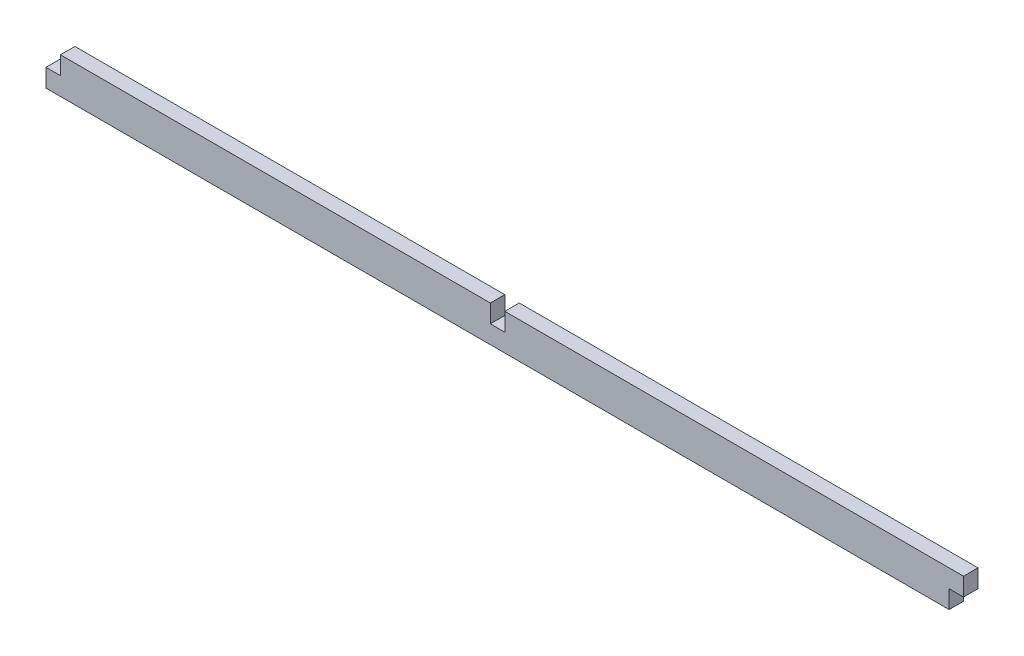
ISO-10303-21;
HEADER;
FILE_DESCRIPTION(('STEP AP214'),'2;1');
FILE_NAME('part.step','',(''),(''),'','','');
FILE_SCHEMA(('AUTOMOTIVE_DESIGN { 1 0 10303 214 1 1 1 1 }'));
ENDSEC;
DATA;
#1=APPLICATION_CONTEXT('core data for automotive mechanical design processes');
#2=APPLICATION_PROTOCOL_DEFINITION('international standard','automotive_design',2000,#1);
#3=PRODUCT_CONTEXT('',#1,'mechanical');
#4=PRODUCT('Part','Part','',(#3));
#5=PRODUCT_RELATED_PRODUCT_CATEGORY('part','',(#4));
#6=PRODUCT_DEFINITION_FORMATION('','',#4);
#7=PRODUCT_DEFINITION_CONTEXT('part definition',#1,'design');
#8=PRODUCT_DEFINITION('design','',#6,#7);
#9=PRODUCT_DEFINITION_SHAPE('','',#8);
#10=(LENGTH_UNIT() NAMED_UNIT(*) SI_UNIT(.MILLI.,.METRE.));
#11=(NAMED_UNIT(*) PLANE_ANGLE_UNIT() SI_UNIT($,.RADIAN.));
#12=(NAMED_UNIT(*) SI_UNIT($,.STERADIAN.) SOLID_ANGLE_UNIT());
#13=UNCERTAINTY_MEASURE_WITH_UNIT(LENGTH_MEASURE(1.E-05),#10,'distance_accuracy_value','');
#14=(GEOMETRIC_REPRESENTATION_CONTEXT(3) GLOBAL_UNCERTAINTY_ASSIGNED_CONTEXT((#13)) GLOBAL_UNIT_ASSIGNED_CONTEXT((#10,
#11,#12)) REPRESENTATION_CONTEXT('',''));
#15=CARTESIAN_POINT('',(0.,0.,0.));
#16=DIRECTION('',(0.,0.,1.));
#17=DIRECTION('',(1.,0.,0.));
#18=AXIS2_PLACEMENT_3D('',#15,#16,#17);
#19=CARTESIAN_POINT('',(-302.5,0.,10.));
#20=DIRECTION('',(-1.,0.,0.));
#21=DIRECTION('',(0.,0.,1.));
#22=AXIS2_PLACEMENT_3D('',#19,#20,#21);
#23=PLANE('',#22);
#24=DIRECTION('',(0.,1.,0.));
#25=VECTOR('',#24,1.);
#26=CARTESIAN_POINT('',(-302.5,0.,0.));
#27=LINE('',#26,#25);
#28=CARTESIAN_POINT('',(-302.5,0.,0.));
#29=VERTEX_POINT('',#28);
#30=CARTESIAN_POINT('',(-302.5,12.5,0.));
#31=VERTEX_POINT('',#30);
#32=EDGE_CURVE('E159',#29,#31,#27,.T.);
#33=ORIENTED_EDGE('',*,*,#32,.F.);
#34=DIRECTION('',(0.,0.,-1.));
#35=VECTOR('',#34,1.);
#36=CARTESIAN_POINT('',(-302.5,0.,10.));
#37=LINE('',#36,#35);
#38=CARTESIAN_POINT('',(-302.5,0.,10.));
#39=VERTEX_POINT('',#38);
#40=EDGE_CURVE('E11',#39,#29,#37,.T.);
#41=ORIENTED_EDGE('',*,*,#40,.F.);
#42=DIRECTION('',(0.,1.,0.));
#43=VECTOR('',#42,1.);
#44=CARTESIAN_POINT('',(-302.5,0.,10.));
#45=LINE('',#44,#43);
#46=CARTESIAN_POINT('',(-302.5,12.5,10.));
#47=VERTEX_POINT('',#46);
#48=EDGE_CURVE('E188',#39,#47,#45,.T.);
#49=ORIENTED_EDGE('',*,*,#48,.T.);
#50=DIRECTION('',(0.,0.,-1.));
#51=VECTOR('',#50,1.);
#52=CARTESIAN_POINT('',(-302.5,12.5,10.));
#53=LINE('',#52,#51);
#54=EDGE_CURVE('E57',#47,#31,#53,.T.);
#55=ORIENTED_EDGE('',*,*,#54,.T.);
#56=EDGE_LOOP('',(#33,#41,#49,#55));
#57=FACE_BOUND('',#56,.T.);
#58=ADVANCED_FACE('F41',(#57),#23,.T.);
#59=CARTESIAN_POINT('',(0.,0.,10.));
#60=DIRECTION('',(0.,1.,0.));
#61=DIRECTION('',(0.,0.,1.));
#62=AXIS2_PLACEMENT_3D('',#59,#60,#61);
#63=PLANE('',#62);
#64=DIRECTION('',(1.,0.,0.));
#65=VECTOR('',#64,1.);
#66=CARTESIAN_POINT('',(0.,0.,0.));
#67=LINE('',#66,#65);
#68=CARTESIAN_POINT('',(-312.5,0.,0.));
#69=VERTEX_POINT('',#68);
#70=EDGE_CURVE('E161',#69,#29,#67,.T.);
#71=ORIENTED_EDGE('',*,*,#70,.F.);
#72=DIRECTION('',(0.,0.,-1.));
#73=VECTOR('',#72,1.);
#74=CARTESIAN_POINT('',(-312.5,0.,10.));
#75=LINE('',#74,#73);
#76=CARTESIAN_POINT('',(-312.5,0.,10.));
#77=VERTEX_POINT('',#76);
#78=EDGE_CURVE('E49',#77,#69,#75,.T.);
#79=ORIENTED_EDGE('',*,*,#78,.F.);
#80=DIRECTION('',(1.,0.,0.));
#81=VECTOR('',#80,1.);
#82=CARTESIAN_POINT('',(0.,0.,10.));
#83=LINE('',#82,#81);
#84=EDGE_CURVE('E220',#77,#39,#83,.T.);
#85=ORIENTED_EDGE('',*,*,#84,.T.);
#86=ORIENTED_EDGE('',*,*,#40,.T.);
#87=EDGE_LOOP('',(#71,#79,#85,#86));
#88=FACE_BOUND('',#87,.T.);
#89=ADVANCED_FACE('F219',(#88),#63,.T.);
#90=CARTESIAN_POINT('',(-312.5,0.,10.));
#91=DIRECTION('',(1.,0.,0.));
#92=DIRECTION('',(0.,0.,-1.));
#93=AXIS2_PLACEMENT_3D('',#90,#91,#92);
#94=PLANE('',#93);
#95=DIRECTION('',(0.,-1.,0.));
#96=VECTOR('',#95,1.);
#97=CARTESIAN_POINT('',(-312.5,0.,0.));
#98=LINE('',#97,#96);
#99=CARTESIAN_POINT('',(-312.5,-12.5,0.));
#100=VERTEX_POINT('',#99);
#101=EDGE_CURVE('E164',#69,#100,#98,.T.);
#102=ORIENTED_EDGE('',*,*,#101,.T.);
#103=DIRECTION('',(0.,0.,-1.));
#104=VECTOR('',#103,1.);
#105=CARTESIAN_POINT('',(-312.5,-12.5,10.));
#106=LINE('',#105,#104);
#107=CARTESIAN_POINT('',(-312.5,-12.5,10.));
#108=VERTEX_POINT('',#107);
#109=EDGE_CURVE('E204',#108,#100,#106,.T.);
#110=ORIENTED_EDGE('',*,*,#109,.F.);
#111=DIRECTION('',(0.,-1.,0.));
#112=VECTOR('',#111,1.);
#113=CARTESIAN_POINT('',(-312.5,0.,10.));
#114=LINE('',#113,#112);
#115=EDGE_CURVE('E211',#77,#108,#114,.T.);
#116=ORIENTED_EDGE('',*,*,#115,.F.);
#117=ORIENTED_EDGE('',*,*,#78,.T.);
#118=EDGE_LOOP('',(#102,#110,#116,#117));
#119=FACE_BOUND('',#118,.T.);
#120=ADVANCED_FACE('F209',(#119),#94,.F.);
#121=CARTESIAN_POINT('',(0.,-12.5,10.));
#122=DIRECTION('',(0.,1.,0.));
#123=DIRECTION('',(0.,0.,1.));
#124=AXIS2_PLACEMENT_3D('',#121,#122,#123);
#125=PLANE('',#124);
#126=DIRECTION('',(1.,0.,0.));
#127=VECTOR('',#126,1.);
#128=CARTESIAN_POINT('',(0.,-12.5,0.));
#129=LINE('',#128,#127);
#130=CARTESIAN_POINT('',(312.5,-12.5,0.));
#131=VERTEX_POINT('',#130);
#132=EDGE_CURVE('E166',#100,#131,#129,.T.);
#133=ORIENTED_EDGE('',*,*,#132,.T.);
#134=DIRECTION('',(0.,0.,-1.));
#135=VECTOR('',#134,1.);
#136=CARTESIAN_POINT('',(312.5,-12.5,10.));
#137=LINE('',#136,#135);
#138=CARTESIAN_POINT('',(312.5,-12.5,10.));
#139=VERTEX_POINT('',#138);
#140=EDGE_CURVE('E202',#139,#131,#137,.T.);
#141=ORIENTED_EDGE('',*,*,#140,.F.);
#142=DIRECTION('',(1.,0.,0.));
#143=VECTOR('',#142,1.);
#144=CARTESIAN_POINT('',(0.,-12.5,10.));
#145=LINE('',#144,#143);
#146=EDGE_CURVE('E393',#108,#139,#145,.T.);
#147=ORIENTED_EDGE('',*,*,#146,.F.);
#148=ORIENTED_EDGE('',*,*,#109,.T.);
#149=EDGE_LOOP('',(#133,#141,#147,#148));
#150=FACE_BOUND('',#149,.T.);
#151=ADVANCED_FACE('F238',(#150),#125,.F.);
#152=CARTESIAN_POINT('',(312.5,0.,10.));
#153=DIRECTION('',(1.,0.,0.));
#154=DIRECTION('',(0.,0.,-1.));
#155=AXIS2_PLACEMENT_3D('',#152,#153,#154);
#156=PLANE('',#155);
#157=DIRECTION('',(0.,-1.,0.));
#158=VECTOR('',#157,1.);
#159=CARTESIAN_POINT('',(312.5,0.,0.));
#160=LINE('',#159,#158);
#161=CARTESIAN_POINT('',(312.5,0.,0.));
#162=VERTEX_POINT('',#161);
#163=EDGE_CURVE('E169',#162,#131,#160,.T.);
#164=ORIENTED_EDGE('',*,*,#163,.F.);
#165=DIRECTION('',(0.,0.,-1.));
#166=VECTOR('',#165,1.);
#167=CARTESIAN_POINT('',(312.5,0.,10.));
#168=LINE('',#167,#166);
#169=CARTESIAN_POINT('',(312.5,0.,10.));
#170=VERTEX_POINT('',#169);
#171=EDGE_CURVE('E200',#170,#162,#168,.T.);
#172=ORIENTED_EDGE('',*,*,#171,.F.);
#173=DIRECTION('',(0.,-1.,0.));
#174=VECTOR('',#173,1.);
#175=CARTESIAN_POINT('',(312.5,0.,10.));
#176=LINE('',#175,#174);
#177=EDGE_CURVE('E391',#170,#139,#176,.T.);
#178=ORIENTED_EDGE('',*,*,#177,.T.);
#179=ORIENTED_EDGE('',*,*,#140,.T.);
#180=EDGE_LOOP('',(#164,#172,#178,#179));
#181=FACE_BOUND('',#180,.T.);
#182=ADVANCED_FACE('F243',(#181),#156,.T.);
#183=CARTESIAN_POINT('',(0.,0.,10.));
#184=DIRECTION('',(0.,1.,0.));
#185=DIRECTION('',(0.,0.,1.));
#186=AXIS2_PLACEMENT_3D('',#183,#184,#185);
#187=PLANE('',#186);
#188=DIRECTION('',(1.,0.,0.));
#189=VECTOR('',#188,1.);
#190=CARTESIAN_POINT('',(0.,0.,0.));
#191=LINE('',#190,#189);
#192=CARTESIAN_POINT('',(322.5,0.,0.));
#193=VERTEX_POINT('',#192);
#194=EDGE_CURVE('E172',#162,#193,#191,.T.);
#195=ORIENTED_EDGE('',*,*,#194,.T.);
#196=DIRECTION('',(0.,0.,-1.));
#197=VECTOR('',#196,1.);
#198=CARTESIAN_POINT('',(322.5,0.,10.));
#199=LINE('',#198,#197);
#200=CARTESIAN_POINT('',(322.5,0.,10.));
#201=VERTEX_POINT('',#200);
#202=EDGE_CURVE('E197',#201,#193,#199,.T.);
#203=ORIENTED_EDGE('',*,*,#202,.F.);
#204=DIRECTION('',(1.,0.,0.));
#205=VECTOR('',#204,1.);
#206=CARTESIAN_POINT('',(0.,0.,10.));
#207=LINE('',#206,#205);
#208=EDGE_CURVE('E386',#170,#201,#207,.T.);
#209=ORIENTED_EDGE('',*,*,#208,.F.);
#210=ORIENTED_EDGE('',*,*,#171,.T.);
#211=EDGE_LOOP('',(#195,#203,#209,#210));
#212=FACE_BOUND('',#211,.T.);
#213=ADVANCED_FACE('F247',(#212),#187,.F.);
#214=CARTESIAN_POINT('',(322.5,0.,10.));
#215=DIRECTION('',(-1.,0.,0.));
#216=DIRECTION('',(0.,0.,1.));
#217=AXIS2_PLACEMENT_3D('',#214,#215,#216);
#218=PLANE('',#217);
#219=DIRECTION('',(0.,1.,0.));
#220=VECTOR('',#219,1.);
#221=CARTESIAN_POINT('',(322.5,0.,0.));
#222=LINE('',#221,#220);
#223=CARTESIAN_POINT('',(322.5,12.5,0.));
#224=VERTEX_POINT('',#223);
#225=EDGE_CURVE('E174',#193,#224,#222,.T.);
#226=ORIENTED_EDGE('',*,*,#225,.T.);
#227=DIRECTION('',(0.,0.,-1.));
#228=VECTOR('',#227,1.);
#229=CARTESIAN_POINT('',(322.5,12.5,10.));
#230=LINE('',#229,#228);
#231=CARTESIAN_POINT('',(322.5,12.5,10.));
#232=VERTEX_POINT('',#231);
#233=EDGE_CURVE('E194',#232,#224,#230,.T.);
#234=ORIENTED_EDGE('',*,*,#233,.F.);
#235=DIRECTION('',(0.,1.,0.));
#236=VECTOR('',#235,1.);
#237=CARTESIAN_POINT('',(322.5,0.,10.));
#238=LINE('',#237,#236);
#239=EDGE_CURVE('E383',#201,#232,#238,.T.);
#240=ORIENTED_EDGE('',*,*,#239,.F.);
#241=ORIENTED_EDGE('',*,*,#202,.T.);
#242=EDGE_LOOP('',(#226,#234,#240,#241));
#243=FACE_BOUND('',#242,.T.);
#244=ADVANCED_FACE('F251',(#243),#218,.F.);
#245=CARTESIAN_POINT('',(0.,12.5,10.));
#246=DIRECTION('',(0.,-1.,0.));
#247=DIRECTION('',(0.,0.,-1.));
#248=AXIS2_PLACEMENT_3D('',#245,#246,#247);
#249=PLANE('',#248);
#250=DIRECTION('',(-1.,0.,0.));
#251=VECTOR('',#250,1.);
#252=CARTESIAN_POINT('',(0.,12.5,0.));
#253=LINE('',#252,#251);
#254=CARTESIAN_POINT('',(4.99999999999984,12.5,0.));
#255=VERTEX_POINT('',#254);
#256=EDGE_CURVE('E176',#224,#255,#253,.T.);
#257=ORIENTED_EDGE('',*,*,#256,.T.);
#258=DIRECTION('',(0.,0.,-1.));
#259=VECTOR('',#258,1.);
#260=CARTESIAN_POINT('',(4.99999999999984,12.5,10.));
#261=LINE('',#260,#259);
#262=CARTESIAN_POINT('',(4.99999999999984,12.5,10.));
#263=VERTEX_POINT('',#262);
#264=EDGE_CURVE('E192',#263,#255,#261,.T.);
#265=ORIENTED_EDGE('',*,*,#264,.F.);
#266=DIRECTION('',(-1.,0.,0.));
#267=VECTOR('',#266,1.);
#268=CARTESIAN_POINT('',(0.,12.5,10.));
#269=LINE('',#268,#267);
#270=EDGE_CURVE('E154',#232,#263,#269,.T.);
#271=ORIENTED_EDGE('',*,*,#270,.F.);
#272=ORIENTED_EDGE('',*,*,#233,.T.);
#273=EDGE_LOOP('',(#257,#265,#271,#272));
#274=FACE_BOUND('',#273,.T.);
#275=ADVANCED_FACE('F255',(#274),#249,.F.);
#276=CARTESIAN_POINT('',(4.99999999999983,0.,10.));
#277=DIRECTION('',(-1.,0.,0.));
#278=DIRECTION('',(0.,-1.,0.));
#279=AXIS2_PLACEMENT_3D('',#276,#277,#278);
#280=PLANE('',#279);
#281=DIRECTION('',(0.,1.,0.));
#282=VECTOR('',#281,1.);
#283=CARTESIAN_POINT('',(4.99999999999983,0.,0.));
#284=LINE('',#283,#282);
#285=CARTESIAN_POINT('',(4.99999999999983,0.,0.));
#286=VERTEX_POINT('',#285);
#287=EDGE_CURVE('E179',#286,#255,#284,.T.);
#288=ORIENTED_EDGE('',*,*,#287,.F.);
#289=DIRECTION('',(0.,0.,-1.));
#290=VECTOR('',#289,1.);
#291=CARTESIAN_POINT('',(4.99999999999983,0.,10.));
#292=LINE('',#291,#290);
#293=CARTESIAN_POINT('',(4.99999999999983,0.,10.));
#294=VERTEX_POINT('',#293);
#295=EDGE_CURVE('E141',#294,#286,#292,.T.);
#296=ORIENTED_EDGE('',*,*,#295,.F.);
#297=DIRECTION('',(0.,1.,0.));
#298=VECTOR('',#297,1.);
#299=CARTESIAN_POINT('',(4.99999999999983,0.,10.));
#300=LINE('',#299,#298);
#301=EDGE_CURVE('E152',#294,#263,#300,.T.);
#302=ORIENTED_EDGE('',*,*,#301,.T.);
#303=ORIENTED_EDGE('',*,*,#264,.T.);
#304=EDGE_LOOP('',(#288,#296,#302,#303));
#305=FACE_BOUND('',#304,.T.);
#306=ADVANCED_FACE('F259',(#305),#280,.T.);
#307=CARTESIAN_POINT('',(0.,0.,10.));
#308=DIRECTION('',(0.,1.,0.));
#309=DIRECTION('',(-1.,0.,0.));
#310=AXIS2_PLACEMENT_3D('',#307,#308,#309);
#311=PLANE('',#310);
#312=DIRECTION('',(1.,0.,0.));
#313=VECTOR('',#312,1.);
#314=CARTESIAN_POINT('',(0.,0.,0.));
#315=LINE('',#314,#313);
#316=CARTESIAN_POINT('',(-5.00000000000017,0.,0.));
#317=VERTEX_POINT('',#316);
#318=EDGE_CURVE('E138',#317,#286,#315,.T.);
#319=ORIENTED_EDGE('',*,*,#318,.F.);
#320=DIRECTION('',(0.,0.,-1.));
#321=VECTOR('',#320,1.);
#322=CARTESIAN_POINT('',(-5.00000000000017,0.,10.));
#323=LINE('',#322,#321);
#324=CARTESIAN_POINT('',(-5.00000000000017,0.,10.));
#325=VERTEX_POINT('',#324);
#326=EDGE_CURVE('E132',#325,#317,#323,.T.);
#327=ORIENTED_EDGE('',*,*,#326,.F.);
#328=DIRECTION('',(1.,0.,0.));
#329=VECTOR('',#328,1.);
#330=CARTESIAN_POINT('',(0.,0.,10.));
#331=LINE('',#330,#329);
#332=EDGE_CURVE('E136',#325,#294,#331,.T.);
#333=ORIENTED_EDGE('',*,*,#332,.T.);
#334=ORIENTED_EDGE('',*,*,#295,.T.);
#335=EDGE_LOOP('',(#319,#327,#333,#334));
#336=FACE_BOUND('',#335,.T.);
#337=ADVANCED_FACE('F134',(#336),#311,.T.);
#338=CARTESIAN_POINT('',(-5.00000000000017,0.,10.));
#339=DIRECTION('',(-1.,0.,0.));
#340=DIRECTION('',(0.,-1.,0.));
#341=AXIS2_PLACEMENT_3D('',#338,#339,#340);
#342=PLANE('',#341);
#343=DIRECTION('',(0.,1.,0.));
#344=VECTOR('',#343,1.);
#345=CARTESIAN_POINT('',(-5.00000000000017,0.,0.));
#346=LINE('',#345,#344);
#347=CARTESIAN_POINT('',(-5.00000000000017,12.5,0.));
#348=VERTEX_POINT('',#347);
#349=EDGE_CURVE('E183',#317,#348,#346,.T.);
#350=ORIENTED_EDGE('',*,*,#349,.T.);
#351=DIRECTION('',(0.,0.,-1.));
#352=VECTOR('',#351,1.);
#353=CARTESIAN_POINT('',(-5.00000000000017,12.5,10.));
#354=LINE('',#353,#352);
#355=CARTESIAN_POINT('',(-5.00000000000017,12.5,10.));
#356=VERTEX_POINT('',#355);
#357=EDGE_CURVE('E95',#356,#348,#354,.T.);
#358=ORIENTED_EDGE('',*,*,#357,.F.);
#359=DIRECTION('',(0.,1.,0.));
#360=VECTOR('',#359,1.);
#361=CARTESIAN_POINT('',(-5.00000000000017,0.,10.));
#362=LINE('',#361,#360);
#363=EDGE_CURVE('E143',#325,#356,#362,.T.);
#364=ORIENTED_EDGE('',*,*,#363,.F.);
#365=ORIENTED_EDGE('',*,*,#326,.T.);
#366=EDGE_LOOP('',(#350,#358,#364,#365));
#367=FACE_BOUND('',#366,.T.);
#368=ADVANCED_FACE('F144',(#367),#342,.F.);
#369=CARTESIAN_POINT('',(0.,12.5,10.));
#370=DIRECTION('',(0.,1.,0.));
#371=DIRECTION('',(0.,0.,1.));
#372=AXIS2_PLACEMENT_3D('',#369,#370,#371);
#373=PLANE('',#372);
#374=DIRECTION('',(1.,0.,0.));
#375=VECTOR('',#374,1.);
#376=CARTESIAN_POINT('',(0.,12.5,0.));
#377=LINE('',#376,#375);
#378=EDGE_CURVE('E185',#31,#348,#377,.T.);
#379=ORIENTED_EDGE('',*,*,#378,.F.);
#380=ORIENTED_EDGE('',*,*,#54,.F.);
#381=DIRECTION('',(1.,0.,0.));
#382=VECTOR('',#381,1.);
#383=CARTESIAN_POINT('',(0.,12.5,10.));
#384=LINE('',#383,#382);
#385=EDGE_CURVE('E147',#47,#356,#384,.T.);
#386=ORIENTED_EDGE('',*,*,#385,.T.);
#387=ORIENTED_EDGE('',*,*,#357,.T.);
#388=EDGE_LOOP('',(#379,#380,#386,#387));
#389=FACE_BOUND('',#388,.T.);
#390=ADVANCED_FACE('F221',(#389),#373,.T.);
#391=CARTESIAN_POINT('',(0.,0.,10.));
#392=DIRECTION('',(0.,0.,1.));
#393=DIRECTION('',(1.,0.,0.));
#394=AXIS2_PLACEMENT_3D('',#391,#392,#393);
#395=PLANE('',#394);
#396=ORIENTED_EDGE('',*,*,#48,.F.);
#397=ORIENTED_EDGE('',*,*,#84,.F.);
#398=ORIENTED_EDGE('',*,*,#115,.T.);
#399=ORIENTED_EDGE('',*,*,#146,.T.);
#400=ORIENTED_EDGE('',*,*,#177,.F.);
#401=ORIENTED_EDGE('',*,*,#208,.T.);
#402=ORIENTED_EDGE('',*,*,#239,.T.);
#403=ORIENTED_EDGE('',*,*,#270,.T.);
#404=ORIENTED_EDGE('',*,*,#301,.F.);
#405=ORIENTED_EDGE('',*,*,#332,.F.);
#406=ORIENTED_EDGE('',*,*,#363,.T.);
#407=ORIENTED_EDGE('',*,*,#385,.F.);
#408=EDGE_LOOP('',(#396,#397,#398,#399,#400,#401,#402,#403,#404,#405,#406,#407));
#409=FACE_BOUND('',#408,.T.);
#410=ADVANCED_FACE('F150',(#409),#395,.T.);
#411=CARTESIAN_POINT('',(0.,0.,0.));
#412=DIRECTION('',(0.,0.,1.));
#413=DIRECTION('',(1.,0.,0.));
#414=AXIS2_PLACEMENT_3D('',#411,#412,#413);
#415=PLANE('',#414);
#416=ORIENTED_EDGE('',*,*,#32,.T.);
#417=ORIENTED_EDGE('',*,*,#378,.T.);
#418=ORIENTED_EDGE('',*,*,#349,.F.);
#419=ORIENTED_EDGE('',*,*,#318,.T.);
#420=ORIENTED_EDGE('',*,*,#287,.T.);
#421=ORIENTED_EDGE('',*,*,#256,.F.);
#422=ORIENTED_EDGE('',*,*,#225,.F.);
#423=ORIENTED_EDGE('',*,*,#194,.F.);
#424=ORIENTED_EDGE('',*,*,#163,.T.);
#425=ORIENTED_EDGE('',*,*,#132,.F.);
#426=ORIENTED_EDGE('',*,*,#101,.F.);
#427=ORIENTED_EDGE('',*,*,#70,.T.);
#428=EDGE_LOOP('',(#416,#417,#418,#419,#420,#421,#422,#423,#424,#425,#426,#427));
#429=FACE_BOUND('',#428,.T.);
#430=ADVANCED_FACE('F218',(#429),#415,.F.);
#431=CLOSED_SHELL('',(#58,#89,#120,#151,#182,#213,#244,#275,#306,#337,#368,#390,#410,#430));
#432=MANIFOLD_SOLID_BREP('B2',#431);
#433=ADVANCED_BREP_SHAPE_REPRESENTATION('',(#18,#432),#14);
#434=SHAPE_DEFINITION_REPRESENTATION(#9,#433);
ENDSEC;
END-ISO-10303-21;
